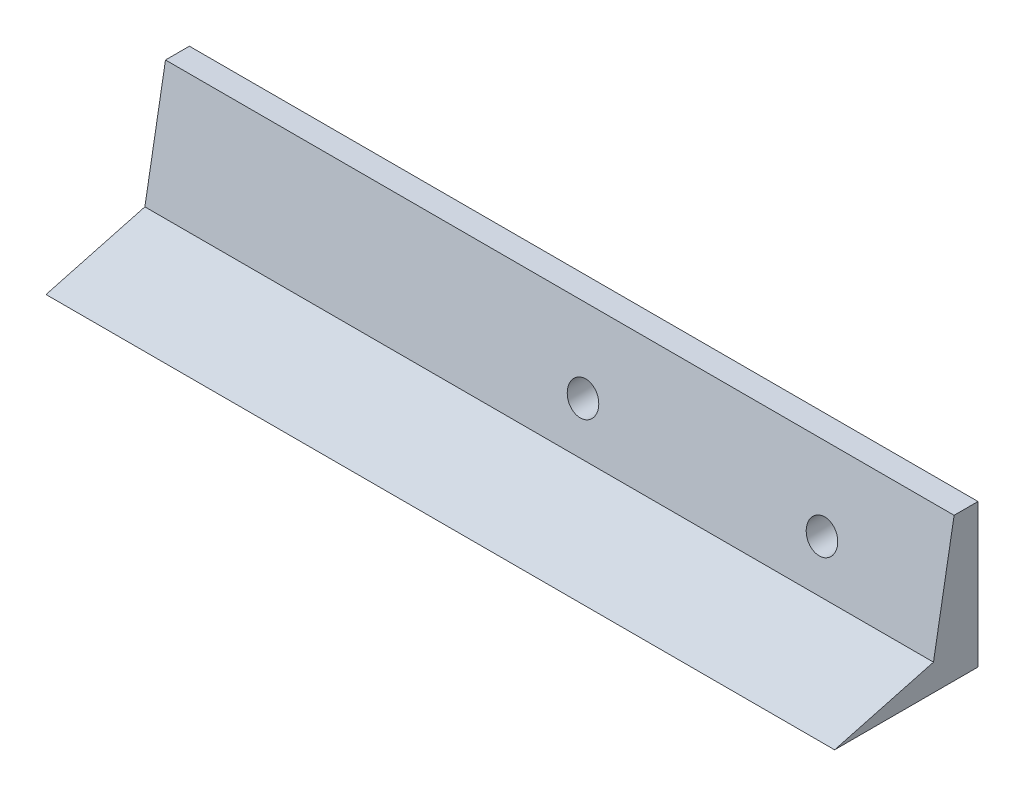
ISO-10303-21;
HEADER;
FILE_DESCRIPTION(('STEP AP214'),'2;1');
FILE_NAME('part.step','',(''),(''),'','','');
FILE_SCHEMA(('AUTOMOTIVE_DESIGN { 1 0 10303 214 1 1 1 1 }'));
ENDSEC;
DATA;
#1=APPLICATION_CONTEXT('core data for automotive mechanical design processes');
#2=APPLICATION_PROTOCOL_DEFINITION('international standard','automotive_design',2000,#1);
#3=PRODUCT_CONTEXT('',#1,'mechanical');
#4=PRODUCT('Part','Part','',(#3));
#5=PRODUCT_RELATED_PRODUCT_CATEGORY('part','',(#4));
#6=PRODUCT_DEFINITION_FORMATION('','',#4);
#7=PRODUCT_DEFINITION_CONTEXT('part definition',#1,'design');
#8=PRODUCT_DEFINITION('design','',#6,#7);
#9=PRODUCT_DEFINITION_SHAPE('','',#8);
#10=(LENGTH_UNIT() NAMED_UNIT(*) SI_UNIT(.MILLI.,.METRE.));
#11=(NAMED_UNIT(*) PLANE_ANGLE_UNIT() SI_UNIT($,.RADIAN.));
#12=(NAMED_UNIT(*) SI_UNIT($,.STERADIAN.) SOLID_ANGLE_UNIT());
#13=UNCERTAINTY_MEASURE_WITH_UNIT(LENGTH_MEASURE(1.E-05),#10,'distance_accuracy_value','');
#14=(GEOMETRIC_REPRESENTATION_CONTEXT(3) GLOBAL_UNCERTAINTY_ASSIGNED_CONTEXT((#13)) GLOBAL_UNIT_ASSIGNED_CONTEXT((#10,
#11,#12)) REPRESENTATION_CONTEXT('',''));
#15=CARTESIAN_POINT('',(0.,0.,0.));
#16=DIRECTION('',(0.,0.,1.));
#17=DIRECTION('',(1.,0.,0.));
#18=AXIS2_PLACEMENT_3D('',#15,#16,#17);
#19=CARTESIAN_POINT('',(100.,0.,30.));
#20=DIRECTION('',(0.,1.,0.));
#21=DIRECTION('',(0.,0.,1.));
#22=AXIS2_PLACEMENT_3D('',#19,#20,#21);
#23=PLANE('',#22);
#24=DIRECTION('',(-1.,0.,0.));
#25=VECTOR('',#24,1.);
#26=CARTESIAN_POINT('',(100.,0.,30.));
#27=LINE('',#26,#25);
#28=CARTESIAN_POINT('',(100.,0.,30.));
#29=VERTEX_POINT('',#28);
#30=CARTESIAN_POINT('',(-65.,0.,30.));
#31=VERTEX_POINT('',#30);
#32=EDGE_CURVE('E103',#29,#31,#27,.T.);
#33=ORIENTED_EDGE('',*,*,#32,.T.);
#34=DIRECTION('',(0.,0.,1.));
#35=VECTOR('',#34,1.);
#36=CARTESIAN_POINT('',(-65.,0.,0.));
#37=LINE('',#36,#35);
#38=CARTESIAN_POINT('',(-65.,0.,0.));
#39=VERTEX_POINT('',#38);
#40=EDGE_CURVE('E102',#39,#31,#37,.T.);
#41=ORIENTED_EDGE('',*,*,#40,.F.);
#42=DIRECTION('',(-1.,0.,0.));
#43=VECTOR('',#42,1.);
#44=CARTESIAN_POINT('',(100.,0.,0.));
#45=LINE('',#44,#43);
#46=CARTESIAN_POINT('',(100.,0.,0.));
#47=VERTEX_POINT('',#46);
#48=EDGE_CURVE('E11',#47,#39,#45,.T.);
#49=ORIENTED_EDGE('',*,*,#48,.F.);
#50=DIRECTION('',(0.,0.,-1.));
#51=VECTOR('',#50,1.);
#52=CARTESIAN_POINT('',(100.,0.,30.));
#53=LINE('',#52,#51);
#54=EDGE_CURVE('E142',#29,#47,#53,.T.);
#55=ORIENTED_EDGE('',*,*,#54,.F.);
#56=EDGE_LOOP('',(#33,#41,#49,#55));
#57=FACE_BOUND('',#56,.T.);
#58=ADVANCED_FACE('F45',(#57),#23,.F.);
#59=CARTESIAN_POINT('',(100.,0.,0.));
#60=DIRECTION('',(0.,0.,1.));
#61=DIRECTION('',(1.,0.,0.));
#62=AXIS2_PLACEMENT_3D('',#59,#60,#61);
#63=PLANE('',#62);
#64=CARTESIAN_POINT('',(75.,15.,0.));
#65=DIRECTION('',(0.,0.,-1.));
#66=DIRECTION('',(-1.,0.,0.));
#67=AXIS2_PLACEMENT_3D('',#64,#65,#66);
#68=CIRCLE('',#67,1.69999999999999);
#69=CARTESIAN_POINT('',(73.3,15.,0.));
#70=VERTEX_POINT('',#69);
#71=EDGE_CURVE('E134',#70,#70,#68,.T.);
#72=ORIENTED_EDGE('',*,*,#71,.F.);
#73=EDGE_LOOP('',(#72));
#74=FACE_BOUND('',#73,.T.);
#75=CARTESIAN_POINT('',(25.,15.,0.));
#76=DIRECTION('',(0.,0.,-1.));
#77=DIRECTION('',(-1.,0.,0.));
#78=AXIS2_PLACEMENT_3D('',#75,#76,#77);
#79=CIRCLE('',#78,1.7);
#80=CARTESIAN_POINT('',(23.3,15.,0.));
#81=VERTEX_POINT('',#80);
#82=EDGE_CURVE('E138',#81,#81,#79,.T.);
#83=ORIENTED_EDGE('',*,*,#82,.F.);
#84=EDGE_LOOP('',(#83));
#85=FACE_BOUND('',#84,.T.);
#86=ORIENTED_EDGE('',*,*,#48,.T.);
#87=DIRECTION('',(0.,-1.,0.));
#88=VECTOR('',#87,1.);
#89=CARTESIAN_POINT('',(-65.,30.,0.));
#90=LINE('',#89,#88);
#91=CARTESIAN_POINT('',(-65.,30.,0.));
#92=VERTEX_POINT('',#91);
#93=EDGE_CURVE('E97',#92,#39,#90,.T.);
#94=ORIENTED_EDGE('',*,*,#93,.F.);
#95=DIRECTION('',(-1.,0.,0.));
#96=VECTOR('',#95,1.);
#97=CARTESIAN_POINT('',(100.,30.,0.));
#98=LINE('',#97,#96);
#99=CARTESIAN_POINT('',(100.,30.,0.));
#100=VERTEX_POINT('',#99);
#101=EDGE_CURVE('E54',#100,#92,#98,.T.);
#102=ORIENTED_EDGE('',*,*,#101,.F.);
#103=DIRECTION('',(0.,1.,0.));
#104=VECTOR('',#103,1.);
#105=CARTESIAN_POINT('',(100.,0.,0.));
#106=LINE('',#105,#104);
#107=EDGE_CURVE('E98',#47,#100,#106,.T.);
#108=ORIENTED_EDGE('',*,*,#107,.F.);
#109=EDGE_LOOP('',(#86,#94,#102,#108));
#110=FACE_BOUND('',#109,.T.);
#111=ADVANCED_FACE('F94',(#74,#85,#110),#63,.F.);
#112=CARTESIAN_POINT('',(100.,30.,5.));
#113=DIRECTION('',(0.,-1.,0.));
#114=DIRECTION('',(0.,0.,-1.));
#115=AXIS2_PLACEMENT_3D('',#112,#113,#114);
#116=PLANE('',#115);
#117=ORIENTED_EDGE('',*,*,#101,.T.);
#118=DIRECTION('',(0.,0.,-1.));
#119=VECTOR('',#118,1.);
#120=CARTESIAN_POINT('',(-65.,30.,5.));
#121=LINE('',#120,#119);
#122=CARTESIAN_POINT('',(-65.,30.,5.));
#123=VERTEX_POINT('',#122);
#124=EDGE_CURVE('E114',#123,#92,#121,.T.);
#125=ORIENTED_EDGE('',*,*,#124,.F.);
#126=DIRECTION('',(-1.,0.,0.));
#127=VECTOR('',#126,1.);
#128=CARTESIAN_POINT('',(100.,30.,5.));
#129=LINE('',#128,#127);
#130=CARTESIAN_POINT('',(100.,30.,5.));
#131=VERTEX_POINT('',#130);
#132=EDGE_CURVE('E159',#131,#123,#129,.T.);
#133=ORIENTED_EDGE('',*,*,#132,.F.);
#134=DIRECTION('',(0.,0.,1.));
#135=VECTOR('',#134,1.);
#136=CARTESIAN_POINT('',(100.,30.,5.));
#137=LINE('',#136,#135);
#138=EDGE_CURVE('E147',#100,#131,#137,.T.);
#139=ORIENTED_EDGE('',*,*,#138,.F.);
#140=EDGE_LOOP('',(#117,#125,#133,#139));
#141=FACE_BOUND('',#140,.T.);
#142=ADVANCED_FACE('F203',(#141),#116,.F.);
#143=CARTESIAN_POINT('',(100.,5.5432287597402,9.31238863067264));
#144=DIRECTION('',(0.,-0.173648177666931,-0.984807753012208));
#145=DIRECTION('',(0.,0.984807753012208,-0.173648177666931));
#146=AXIS2_PLACEMENT_3D('',#143,#144,#145);
#147=PLANE('',#146);
#148=CARTESIAN_POINT('',(75.,15.,7.64490471062698));
#149=DIRECTION('',(0.,-0.173648177666931,-0.984807753012208));
#150=DIRECTION('',(0.,0.984807753012208,-0.173648177666931));
#151=AXIS2_PLACEMENT_3D('',#148,#149,#150);
#152=ELLIPSE('',#151,3.30013648862868,3.25000000000001);
#153=CARTESIAN_POINT('',(75.,18.25,7.07184202332447));
#154=VERTEX_POINT('',#153);
#155=EDGE_CURVE('E48',#154,#154,#152,.T.);
#156=ORIENTED_EDGE('',*,*,#155,.T.);
#157=EDGE_LOOP('',(#156));
#158=FACE_BOUND('',#157,.T.);
#159=CARTESIAN_POINT('',(25.,15.,7.64490471062698));
#160=DIRECTION('',(0.,-0.173648177666931,-0.984807753012208));
#161=DIRECTION('',(0.,0.984807753012208,-0.173648177666931));
#162=AXIS2_PLACEMENT_3D('',#159,#160,#161);
#163=ELLIPSE('',#162,3.30013648862867,3.25);
#164=CARTESIAN_POINT('',(25.,18.25,7.07184202332447));
#165=VERTEX_POINT('',#164);
#166=EDGE_CURVE('E170',#165,#165,#163,.T.);
#167=ORIENTED_EDGE('',*,*,#166,.T.);
#168=EDGE_LOOP('',(#167));
#169=FACE_BOUND('',#168,.T.);
#170=ORIENTED_EDGE('',*,*,#132,.T.);
#171=DIRECTION('',(0.,0.984807753012208,-0.173648177666931));
#172=VECTOR('',#171,1.);
#173=CARTESIAN_POINT('',(-65.,5.5432287597402,9.31238863067264));
#174=LINE('',#173,#172);
#175=CARTESIAN_POINT('',(-65.,5.5432287597402,9.31238863067264));
#176=VERTEX_POINT('',#175);
#177=EDGE_CURVE('E120',#176,#123,#174,.T.);
#178=ORIENTED_EDGE('',*,*,#177,.F.);
#179=DIRECTION('',(-1.,0.,0.));
#180=VECTOR('',#179,1.);
#181=CARTESIAN_POINT('',(100.,5.5432287597402,9.31238863067264));
#182=LINE('',#181,#180);
#183=CARTESIAN_POINT('',(100.,5.5432287597402,9.31238863067264));
#184=VERTEX_POINT('',#183);
#185=EDGE_CURVE('E156',#184,#176,#182,.T.);
#186=ORIENTED_EDGE('',*,*,#185,.F.);
#187=DIRECTION('',(0.,-0.984807753012208,0.173648177666931));
#188=VECTOR('',#187,1.);
#189=CARTESIAN_POINT('',(100.,5.5432287597402,9.31238863067264));
#190=LINE('',#189,#188);
#191=EDGE_CURVE('E67',#131,#184,#190,.T.);
#192=ORIENTED_EDGE('',*,*,#191,.F.);
#193=EDGE_LOOP('',(#170,#178,#186,#192));
#194=FACE_BOUND('',#193,.T.);
#195=ADVANCED_FACE('F179',(#158,#169,#194),#147,.F.);
#196=CARTESIAN_POINT('',(100.,0.,30.));
#197=DIRECTION('',(0.,-0.965925826289068,-0.258819045102522));
#198=DIRECTION('',(0.,0.258819045102522,-0.965925826289068));
#199=AXIS2_PLACEMENT_3D('',#196,#197,#198);
#200=PLANE('',#199);
#201=ORIENTED_EDGE('',*,*,#185,.T.);
#202=DIRECTION('',(0.,0.258819045102522,-0.965925826289068));
#203=VECTOR('',#202,1.);
#204=CARTESIAN_POINT('',(-65.,0.,30.));
#205=LINE('',#204,#203);
#206=EDGE_CURVE('E108',#31,#176,#205,.T.);
#207=ORIENTED_EDGE('',*,*,#206,.F.);
#208=ORIENTED_EDGE('',*,*,#32,.F.);
#209=DIRECTION('',(0.,-0.258819045102522,0.965925826289068));
#210=VECTOR('',#209,1.);
#211=CARTESIAN_POINT('',(100.,0.,30.));
#212=LINE('',#211,#210);
#213=EDGE_CURVE('E62',#184,#29,#212,.T.);
#214=ORIENTED_EDGE('',*,*,#213,.F.);
#215=EDGE_LOOP('',(#201,#207,#208,#214));
#216=FACE_BOUND('',#215,.T.);
#217=ADVANCED_FACE('F215',(#216),#200,.F.);
#218=CARTESIAN_POINT('',(100.,0.,0.));
#219=DIRECTION('',(1.,0.,0.));
#220=DIRECTION('',(0.,0.,-1.));
#221=AXIS2_PLACEMENT_3D('',#218,#219,#220);
#222=PLANE('',#221);
#223=ORIENTED_EDGE('',*,*,#54,.T.);
#224=ORIENTED_EDGE('',*,*,#107,.T.);
#225=ORIENTED_EDGE('',*,*,#138,.T.);
#226=ORIENTED_EDGE('',*,*,#191,.T.);
#227=ORIENTED_EDGE('',*,*,#213,.T.);
#228=EDGE_LOOP('',(#223,#224,#225,#226,#227));
#229=FACE_BOUND('',#228,.T.);
#230=ADVANCED_FACE('F218',(#229),#222,.T.);
#231=CARTESIAN_POINT('',(25.,15.,0.));
#232=DIRECTION('',(0.,0.,-1.));
#233=DIRECTION('',(-1.,0.,0.));
#234=AXIS2_PLACEMENT_3D('',#231,#232,#233);
#235=CYLINDRICAL_SURFACE('',#234,1.69999999999999);
#236=CARTESIAN_POINT('',(25.,15.,2.5));
#237=DIRECTION('',(0.,0.,-1.));
#238=DIRECTION('',(-1.,0.,0.));
#239=AXIS2_PLACEMENT_3D('',#236,#237,#238);
#240=CIRCLE('',#239,1.69999999999999);
#241=CARTESIAN_POINT('',(23.3,15.,2.5));
#242=VERTEX_POINT('',#241);
#243=EDGE_CURVE('E167',#242,#242,#240,.F.);
#244=ORIENTED_EDGE('',*,*,#243,.T.);
#245=EDGE_LOOP('',(#244));
#246=FACE_BOUND('',#245,.T.);
#247=ORIENTED_EDGE('',*,*,#82,.T.);
#248=EDGE_LOOP('',(#247));
#249=FACE_BOUND('',#248,.T.);
#250=ADVANCED_FACE('F194',(#246,#249),#235,.F.);
#251=CARTESIAN_POINT('',(75.,15.,0.));
#252=DIRECTION('',(0.,0.,-1.));
#253=DIRECTION('',(-1.,0.,0.));
#254=AXIS2_PLACEMENT_3D('',#251,#252,#253);
#255=CYLINDRICAL_SURFACE('',#254,1.69999999999999);
#256=CARTESIAN_POINT('',(75.,15.,2.5));
#257=DIRECTION('',(0.,0.,-1.));
#258=DIRECTION('',(-1.,0.,0.));
#259=AXIS2_PLACEMENT_3D('',#256,#257,#258);
#260=CIRCLE('',#259,1.69999999999999);
#261=CARTESIAN_POINT('',(73.3,15.,2.5));
#262=VERTEX_POINT('',#261);
#263=EDGE_CURVE('E130',#262,#262,#260,.F.);
#264=ORIENTED_EDGE('',*,*,#263,.T.);
#265=EDGE_LOOP('',(#264));
#266=FACE_BOUND('',#265,.T.);
#267=ORIENTED_EDGE('',*,*,#71,.T.);
#268=EDGE_LOOP('',(#267));
#269=FACE_BOUND('',#268,.T.);
#270=ADVANCED_FACE('F184',(#266,#269),#255,.F.);
#271=CARTESIAN_POINT('',(75.,15.,30.));
#272=DIRECTION('',(0.,0.,-1.));
#273=DIRECTION('',(-1.,0.,0.));
#274=AXIS2_PLACEMENT_3D('',#271,#272,#273);
#275=CYLINDRICAL_SURFACE('',#274,3.25000000000001);
#276=CARTESIAN_POINT('',(75.,15.,2.5));
#277=DIRECTION('',(0.,0.,-1.));
#278=DIRECTION('',(-1.,0.,0.));
#279=AXIS2_PLACEMENT_3D('',#276,#277,#278);
#280=CIRCLE('',#279,3.25000000000001);
#281=CARTESIAN_POINT('',(71.75,15.,2.5));
#282=VERTEX_POINT('',#281);
#283=EDGE_CURVE('E126',#282,#282,#280,.T.);
#284=ORIENTED_EDGE('',*,*,#283,.T.);
#285=EDGE_LOOP('',(#284));
#286=FACE_BOUND('',#285,.T.);
#287=ORIENTED_EDGE('',*,*,#155,.F.);
#288=EDGE_LOOP('',(#287));
#289=FACE_BOUND('',#288,.T.);
#290=ADVANCED_FACE('F181',(#286,#289),#275,.F.);
#291=CARTESIAN_POINT('',(75.,15.,2.5));
#292=DIRECTION('',(0.,0.,-1.));
#293=DIRECTION('',(-1.,0.,0.));
#294=AXIS2_PLACEMENT_3D('',#291,#292,#293);
#295=PLANE('',#294);
#296=ORIENTED_EDGE('',*,*,#283,.F.);
#297=EDGE_LOOP('',(#296));
#298=FACE_BOUND('',#297,.T.);
#299=ORIENTED_EDGE('',*,*,#263,.F.);
#300=EDGE_LOOP('',(#299));
#301=FACE_BOUND('',#300,.T.);
#302=ADVANCED_FACE('F183',(#298,#301),#295,.F.);
#303=CARTESIAN_POINT('',(25.,15.,30.));
#304=DIRECTION('',(0.,0.,-1.));
#305=DIRECTION('',(-1.,0.,0.));
#306=AXIS2_PLACEMENT_3D('',#303,#304,#305);
#307=CYLINDRICAL_SURFACE('',#306,3.25);
#308=CARTESIAN_POINT('',(25.,15.,2.5));
#309=DIRECTION('',(0.,0.,-1.));
#310=DIRECTION('',(-1.,0.,0.));
#311=AXIS2_PLACEMENT_3D('',#308,#309,#310);
#312=CIRCLE('',#311,3.25);
#313=CARTESIAN_POINT('',(21.75,15.,2.5));
#314=VERTEX_POINT('',#313);
#315=EDGE_CURVE('E125',#314,#314,#312,.T.);
#316=ORIENTED_EDGE('',*,*,#315,.T.);
#317=EDGE_LOOP('',(#316));
#318=FACE_BOUND('',#317,.T.);
#319=ORIENTED_EDGE('',*,*,#166,.F.);
#320=EDGE_LOOP('',(#319));
#321=FACE_BOUND('',#320,.T.);
#322=ADVANCED_FACE('F191',(#318,#321),#307,.F.);
#323=CARTESIAN_POINT('',(25.,15.,2.5));
#324=DIRECTION('',(0.,0.,-1.));
#325=DIRECTION('',(-1.,0.,0.));
#326=AXIS2_PLACEMENT_3D('',#323,#324,#325);
#327=PLANE('',#326);
#328=ORIENTED_EDGE('',*,*,#315,.F.);
#329=EDGE_LOOP('',(#328));
#330=FACE_BOUND('',#329,.T.);
#331=ORIENTED_EDGE('',*,*,#243,.F.);
#332=EDGE_LOOP('',(#331));
#333=FACE_BOUND('',#332,.T.);
#334=ADVANCED_FACE('F225',(#330,#333),#327,.F.);
#335=CARTESIAN_POINT('',(-65.,0.,0.));
#336=DIRECTION('',(-1.,0.,0.));
#337=DIRECTION('',(0.,0.,1.));
#338=AXIS2_PLACEMENT_3D('',#335,#336,#337);
#339=PLANE('',#338);
#340=ORIENTED_EDGE('',*,*,#93,.T.);
#341=ORIENTED_EDGE('',*,*,#40,.T.);
#342=ORIENTED_EDGE('',*,*,#206,.T.);
#343=ORIENTED_EDGE('',*,*,#177,.T.);
#344=ORIENTED_EDGE('',*,*,#124,.T.);
#345=EDGE_LOOP('',(#340,#341,#342,#343,#344));
#346=FACE_BOUND('',#345,.T.);
#347=ADVANCED_FACE('F111',(#346),#339,.T.);
#348=CLOSED_SHELL('',(#58,#111,#142,#195,#217,#230,#250,#270,#290,#302,#322,#334,#347));
#349=MANIFOLD_SOLID_BREP('B2',#348);
#350=ADVANCED_BREP_SHAPE_REPRESENTATION('',(#18,#349),#14);
#351=SHAPE_DEFINITION_REPRESENTATION(#9,#350);
ENDSEC;
END-ISO-10303-21;
